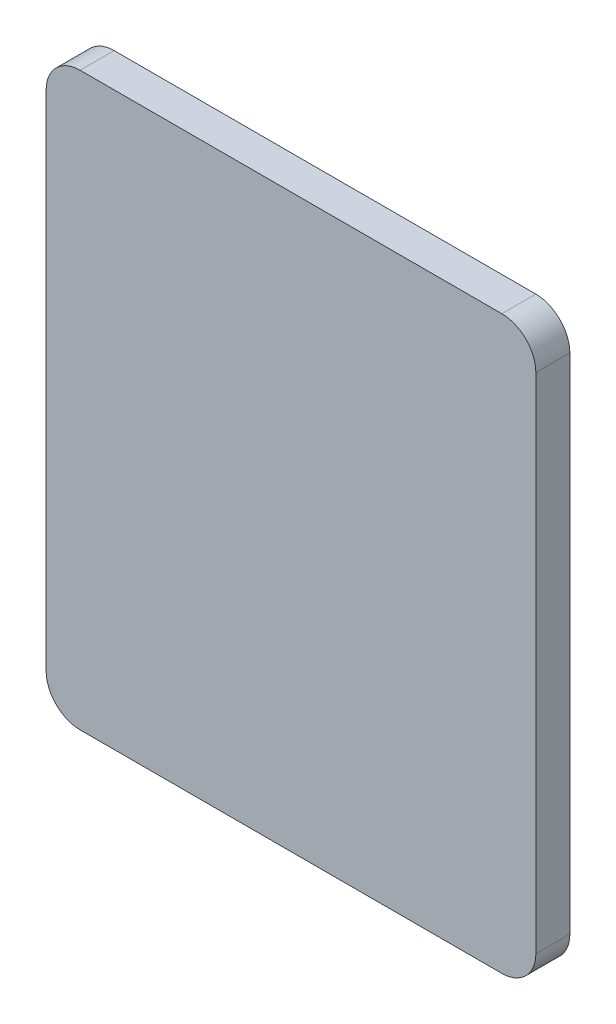
ISO-10303-21;
HEADER;
FILE_DESCRIPTION(('STEP AP214'),'2;1');
FILE_NAME('part.step','',(''),(''),'','','');
FILE_SCHEMA(('AUTOMOTIVE_DESIGN { 1 0 10303 214 1 1 1 1 }'));
ENDSEC;
DATA;
#1=APPLICATION_CONTEXT('core data for automotive mechanical design processes');
#2=APPLICATION_PROTOCOL_DEFINITION('international standard','automotive_design',2000,#1);
#3=PRODUCT_CONTEXT('',#1,'mechanical');
#4=PRODUCT('Part','Part','',(#3));
#5=PRODUCT_RELATED_PRODUCT_CATEGORY('part','',(#4));
#6=PRODUCT_DEFINITION_FORMATION('','',#4);
#7=PRODUCT_DEFINITION_CONTEXT('part definition',#1,'design');
#8=PRODUCT_DEFINITION('design','',#6,#7);
#9=PRODUCT_DEFINITION_SHAPE('','',#8);
#10=(LENGTH_UNIT() NAMED_UNIT(*) SI_UNIT(.MILLI.,.METRE.));
#11=(NAMED_UNIT(*) PLANE_ANGLE_UNIT() SI_UNIT($,.RADIAN.));
#12=(NAMED_UNIT(*) SI_UNIT($,.STERADIAN.) SOLID_ANGLE_UNIT());
#13=UNCERTAINTY_MEASURE_WITH_UNIT(LENGTH_MEASURE(1.E-05),#10,'distance_accuracy_value','');
#14=(GEOMETRIC_REPRESENTATION_CONTEXT(3) GLOBAL_UNCERTAINTY_ASSIGNED_CONTEXT((#13)) GLOBAL_UNIT_ASSIGNED_CONTEXT((#10,
#11,#12)) REPRESENTATION_CONTEXT('',''));
#15=CARTESIAN_POINT('',(0.,0.,0.));
#16=DIRECTION('',(0.,0.,1.));
#17=DIRECTION('',(1.,0.,0.));
#18=AXIS2_PLACEMENT_3D('',#15,#16,#17);
#19=CARTESIAN_POINT('',(6.7,0.500000000000002,-0.05));
#20=DIRECTION('',(0.,0.,1.));
#21=DIRECTION('',(1.,0.,0.));
#22=AXIS2_PLACEMENT_3D('',#19,#20,#21);
#23=CYLINDRICAL_SURFACE('',#22,0.500000000000001);
#24=CARTESIAN_POINT('',(6.7,0.500000000000002,0.5));
#25=DIRECTION('',(0.,0.,1.));
#26=DIRECTION('',(1.,0.,0.));
#27=AXIS2_PLACEMENT_3D('',#24,#25,#26);
#28=CIRCLE('',#27,0.500000000000001);
#29=CARTESIAN_POINT('',(6.7,0.,0.5));
#30=VERTEX_POINT('',#29);
#31=CARTESIAN_POINT('',(7.2,0.500000000000001,0.5));
#32=VERTEX_POINT('',#31);
#33=EDGE_CURVE('E82',#30,#32,#28,.T.);
#34=ORIENTED_EDGE('',*,*,#33,.F.);
#35=CARTESIAN_POINT('',(6.7,0.,0.5));
#36=CARTESIAN_POINT('',(6.7,0.,0.));
#37=B_SPLINE_CURVE_WITH_KNOTS('',1,(#35,#36),.UNSPECIFIED.,.F.,.F.,(2,2),(0.,1.),.UNSPECIFIED.);
#38=CARTESIAN_POINT('',(6.7,0.,0.));
#39=VERTEX_POINT('',#38);
#40=EDGE_CURVE('E80',#39,#30,#37,.F.);
#41=ORIENTED_EDGE('',*,*,#40,.F.);
#42=CARTESIAN_POINT('',(6.7,0.500000000000002,0.));
#43=DIRECTION('',(0.,0.,1.));
#44=DIRECTION('',(1.,0.,0.));
#45=AXIS2_PLACEMENT_3D('',#42,#43,#44);
#46=CIRCLE('',#45,0.500000000000001);
#47=CARTESIAN_POINT('',(7.2,0.500000000000001,0.));
#48=VERTEX_POINT('',#47);
#49=EDGE_CURVE('E21',#48,#39,#46,.F.);
#50=ORIENTED_EDGE('',*,*,#49,.F.);
#51=CARTESIAN_POINT('',(7.2,0.5,0.5));
#52=CARTESIAN_POINT('',(7.2,0.5,0.));
#53=B_SPLINE_CURVE_WITH_KNOTS('',1,(#51,#52),.UNSPECIFIED.,.F.,.F.,(2,2),(0.,1.),.UNSPECIFIED.);
#54=EDGE_CURVE('E137',#32,#48,#53,.T.);
#55=ORIENTED_EDGE('',*,*,#54,.F.);
#56=EDGE_LOOP('',(#34,#41,#50,#55));
#57=FACE_BOUND('',#56,.T.);
#58=ADVANCED_FACE('F17',(#57),#23,.T.);
#59=CARTESIAN_POINT('',(6.7,7.9,-0.05));
#60=DIRECTION('',(0.,0.,1.));
#61=DIRECTION('',(0.,-1.,0.));
#62=AXIS2_PLACEMENT_3D('',#59,#60,#61);
#63=CYLINDRICAL_SURFACE('',#62,0.500000000000001);
#64=CARTESIAN_POINT('',(6.7,7.9,0.5));
#65=DIRECTION('',(0.,0.,1.));
#66=DIRECTION('',(0.,-1.,0.));
#67=AXIS2_PLACEMENT_3D('',#64,#65,#66);
#68=CIRCLE('',#67,0.500000000000001);
#69=CARTESIAN_POINT('',(7.2,7.9,0.5));
#70=VERTEX_POINT('',#69);
#71=CARTESIAN_POINT('',(6.7,8.4,0.5));
#72=VERTEX_POINT('',#71);
#73=EDGE_CURVE('E119',#70,#72,#68,.T.);
#74=ORIENTED_EDGE('',*,*,#73,.F.);
#75=CARTESIAN_POINT('',(7.2,7.9,0.5));
#76=CARTESIAN_POINT('',(7.2,7.9,0.));
#77=B_SPLINE_CURVE_WITH_KNOTS('',1,(#75,#76),.UNSPECIFIED.,.F.,.F.,(2,2),(0.,1.),.UNSPECIFIED.);
#78=CARTESIAN_POINT('',(7.2,7.9,0.));
#79=VERTEX_POINT('',#78);
#80=EDGE_CURVE('E103',#79,#70,#77,.F.);
#81=ORIENTED_EDGE('',*,*,#80,.F.);
#82=CARTESIAN_POINT('',(6.7,7.9,0.));
#83=DIRECTION('',(0.,0.,1.));
#84=DIRECTION('',(0.,-1.,0.));
#85=AXIS2_PLACEMENT_3D('',#82,#83,#84);
#86=CIRCLE('',#85,0.500000000000001);
#87=CARTESIAN_POINT('',(6.7,8.4,0.));
#88=VERTEX_POINT('',#87);
#89=EDGE_CURVE('E98',#88,#79,#86,.F.);
#90=ORIENTED_EDGE('',*,*,#89,.F.);
#91=CARTESIAN_POINT('',(6.7,8.4,0.));
#92=CARTESIAN_POINT('',(6.7,8.4,0.5));
#93=B_SPLINE_CURVE_WITH_KNOTS('',1,(#91,#92),.UNSPECIFIED.,.F.,.F.,(2,2),(0.,1.),.UNSPECIFIED.);
#94=EDGE_CURVE('E170',#72,#88,#93,.F.);
#95=ORIENTED_EDGE('',*,*,#94,.F.);
#96=EDGE_LOOP('',(#74,#81,#90,#95));
#97=FACE_BOUND('',#96,.T.);
#98=ADVANCED_FACE('F217',(#97),#63,.T.);
#99=CARTESIAN_POINT('',(7.2,0.,0.));
#100=DIRECTION('',(0.,0.,-1.));
#101=DIRECTION('',(-1.,0.,0.));
#102=AXIS2_PLACEMENT_3D('',#99,#100,#101);
#103=PLANE('',#102);
#104=CARTESIAN_POINT('',(0.5,8.4,0.));
#105=CARTESIAN_POINT('',(6.7,8.4,0.));
#106=B_SPLINE_CURVE_WITH_KNOTS('',1,(#104,#105),.UNSPECIFIED.,.F.,.F.,(2,2),(0.,1.),.UNSPECIFIED.);
#107=CARTESIAN_POINT('',(0.5,8.4,0.));
#108=VERTEX_POINT('',#107);
#109=EDGE_CURVE('E129',#88,#108,#106,.F.);
#110=ORIENTED_EDGE('',*,*,#109,.F.);
#111=ORIENTED_EDGE('',*,*,#89,.T.);
#112=CARTESIAN_POINT('',(7.2,0.5,0.));
#113=CARTESIAN_POINT('',(7.2,7.9,0.));
#114=B_SPLINE_CURVE_WITH_KNOTS('',1,(#112,#113),.UNSPECIFIED.,.F.,.F.,(2,2),(0.,1.),.UNSPECIFIED.);
#115=EDGE_CURVE('E96',#48,#79,#114,.T.);
#116=ORIENTED_EDGE('',*,*,#115,.F.);
#117=ORIENTED_EDGE('',*,*,#49,.T.);
#118=CARTESIAN_POINT('',(0.5,0.,0.));
#119=CARTESIAN_POINT('',(6.7,0.,0.));
#120=B_SPLINE_CURVE_WITH_KNOTS('',1,(#118,#119),.UNSPECIFIED.,.F.,.F.,(2,2),(0.,1.),.UNSPECIFIED.);
#121=CARTESIAN_POINT('',(0.5,0.,0.));
#122=VERTEX_POINT('',#121);
#123=EDGE_CURVE('E87',#122,#39,#120,.T.);
#124=ORIENTED_EDGE('',*,*,#123,.F.);
#125=CARTESIAN_POINT('',(0.5,0.5,0.));
#126=DIRECTION('',(0.,0.,1.));
#127=DIRECTION('',(0.,-1.,0.));
#128=AXIS2_PLACEMENT_3D('',#125,#126,#127);
#129=CIRCLE('',#128,0.5);
#130=CARTESIAN_POINT('',(0.,0.5,0.));
#131=VERTEX_POINT('',#130);
#132=EDGE_CURVE('E88',#131,#122,#129,.T.);
#133=ORIENTED_EDGE('',*,*,#132,.F.);
#134=CARTESIAN_POINT('',(0.,0.5,0.));
#135=CARTESIAN_POINT('',(0.,7.9,0.));
#136=B_SPLINE_CURVE_WITH_KNOTS('',1,(#134,#135),.UNSPECIFIED.,.F.,.F.,(2,2),(0.,1.),.UNSPECIFIED.);
#137=CARTESIAN_POINT('',(0.,7.9,0.));
#138=VERTEX_POINT('',#137);
#139=EDGE_CURVE('E156',#138,#131,#136,.F.);
#140=ORIENTED_EDGE('',*,*,#139,.F.);
#141=CARTESIAN_POINT('',(0.5,7.9,0.));
#142=DIRECTION('',(0.,0.,1.));
#143=DIRECTION('',(0.,-1.,0.));
#144=AXIS2_PLACEMENT_3D('',#141,#142,#143);
#145=CIRCLE('',#144,0.5);
#146=EDGE_CURVE('E126',#108,#138,#145,.T.);
#147=ORIENTED_EDGE('',*,*,#146,.F.);
#148=EDGE_LOOP('',(#110,#111,#116,#117,#124,#133,#140,#147));
#149=FACE_BOUND('',#148,.T.);
#150=ADVANCED_FACE('F92',(#149),#103,.T.);
#151=CARTESIAN_POINT('',(0.5,7.9,-0.05));
#152=DIRECTION('',(0.,0.,1.));
#153=DIRECTION('',(0.,-1.,0.));
#154=AXIS2_PLACEMENT_3D('',#151,#152,#153);
#155=CYLINDRICAL_SURFACE('',#154,0.5);
#156=CARTESIAN_POINT('',(0.5,7.9,0.5));
#157=DIRECTION('',(0.,0.,1.));
#158=DIRECTION('',(0.,-1.,0.));
#159=AXIS2_PLACEMENT_3D('',#156,#157,#158);
#160=CIRCLE('',#159,0.5);
#161=CARTESIAN_POINT('',(0.5,8.4,0.5));
#162=VERTEX_POINT('',#161);
#163=CARTESIAN_POINT('',(0.,7.9,0.5));
#164=VERTEX_POINT('',#163);
#165=EDGE_CURVE('E115',#162,#164,#160,.T.);
#166=ORIENTED_EDGE('',*,*,#165,.F.);
#167=CARTESIAN_POINT('',(0.5,8.4,0.));
#168=CARTESIAN_POINT('',(0.5,8.4,0.5));
#169=B_SPLINE_CURVE_WITH_KNOTS('',1,(#167,#168),.UNSPECIFIED.,.F.,.F.,(2,2),(0.,1.),.UNSPECIFIED.);
#170=EDGE_CURVE('E164',#108,#162,#169,.T.);
#171=ORIENTED_EDGE('',*,*,#170,.F.);
#172=ORIENTED_EDGE('',*,*,#146,.T.);
#173=CARTESIAN_POINT('',(0.,7.9,0.));
#174=CARTESIAN_POINT('',(0.,7.9,0.5));
#175=B_SPLINE_CURVE_WITH_KNOTS('',1,(#173,#174),.UNSPECIFIED.,.F.,.F.,(2,2),(0.,1.),.UNSPECIFIED.);
#176=EDGE_CURVE('E163',#164,#138,#175,.F.);
#177=ORIENTED_EDGE('',*,*,#176,.F.);
#178=EDGE_LOOP('',(#166,#171,#172,#177));
#179=FACE_BOUND('',#178,.T.);
#180=ADVANCED_FACE('F215',(#179),#155,.T.);
#181=CARTESIAN_POINT('',(0.5,0.5,-0.05));
#182=DIRECTION('',(0.,0.,1.));
#183=DIRECTION('',(0.,-1.,0.));
#184=AXIS2_PLACEMENT_3D('',#181,#182,#183);
#185=CYLINDRICAL_SURFACE('',#184,0.5);
#186=CARTESIAN_POINT('',(0.5,0.5,0.5));
#187=DIRECTION('',(0.,0.,1.));
#188=DIRECTION('',(0.,-1.,0.));
#189=AXIS2_PLACEMENT_3D('',#186,#187,#188);
#190=CIRCLE('',#189,0.5);
#191=CARTESIAN_POINT('',(0.,0.5,0.5));
#192=VERTEX_POINT('',#191);
#193=CARTESIAN_POINT('',(0.5,0.,0.5));
#194=VERTEX_POINT('',#193);
#195=EDGE_CURVE('E11',#192,#194,#190,.T.);
#196=ORIENTED_EDGE('',*,*,#195,.F.);
#197=CARTESIAN_POINT('',(0.,0.5,0.));
#198=CARTESIAN_POINT('',(0.,0.5,0.5));
#199=B_SPLINE_CURVE_WITH_KNOTS('',1,(#197,#198),.UNSPECIFIED.,.F.,.F.,(2,2),(0.,1.),.UNSPECIFIED.);
#200=EDGE_CURVE('E181',#131,#192,#199,.T.);
#201=ORIENTED_EDGE('',*,*,#200,.F.);
#202=ORIENTED_EDGE('',*,*,#132,.T.);
#203=CARTESIAN_POINT('',(0.5,0.,0.5));
#204=CARTESIAN_POINT('',(0.5,0.,0.));
#205=B_SPLINE_CURVE_WITH_KNOTS('',1,(#203,#204),.UNSPECIFIED.,.F.,.F.,(2,2),(0.,1.),.UNSPECIFIED.);
#206=EDGE_CURVE('E101',#194,#122,#205,.T.);
#207=ORIENTED_EDGE('',*,*,#206,.F.);
#208=EDGE_LOOP('',(#196,#201,#202,#207));
#209=FACE_BOUND('',#208,.T.);
#210=ADVANCED_FACE('F212',(#209),#185,.T.);
#211=CARTESIAN_POINT('',(0.5,0.,0.5));
#212=DIRECTION('',(0.,-1.,0.));
#213=DIRECTION('',(0.,0.,-1.));
#214=AXIS2_PLACEMENT_3D('',#211,#212,#213);
#215=PLANE('',#214);
#216=ORIENTED_EDGE('',*,*,#206,.T.);
#217=ORIENTED_EDGE('',*,*,#123,.T.);
#218=ORIENTED_EDGE('',*,*,#40,.T.);
#219=DIRECTION('',(1.,0.,0.));
#220=VECTOR('',#219,1.);
#221=CARTESIAN_POINT('',(3.6,0.,0.5));
#222=LINE('',#221,#220);
#223=EDGE_CURVE('E124',#194,#30,#222,.T.);
#224=ORIENTED_EDGE('',*,*,#223,.F.);
#225=EDGE_LOOP('',(#216,#217,#218,#224));
#226=FACE_BOUND('',#225,.T.);
#227=ADVANCED_FACE('F100',(#226),#215,.T.);
#228=CARTESIAN_POINT('',(7.2,0.5,0.5));
#229=DIRECTION('',(1.,0.,0.));
#230=DIRECTION('',(0.,0.,-1.));
#231=AXIS2_PLACEMENT_3D('',#228,#229,#230);
#232=PLANE('',#231);
#233=ORIENTED_EDGE('',*,*,#54,.T.);
#234=ORIENTED_EDGE('',*,*,#115,.T.);
#235=ORIENTED_EDGE('',*,*,#80,.T.);
#236=DIRECTION('',(0.,1.,0.));
#237=VECTOR('',#236,1.);
#238=CARTESIAN_POINT('',(7.2,4.2,0.5));
#239=LINE('',#238,#237);
#240=EDGE_CURVE('E122',#32,#70,#239,.T.);
#241=ORIENTED_EDGE('',*,*,#240,.F.);
#242=EDGE_LOOP('',(#233,#234,#235,#241));
#243=FACE_BOUND('',#242,.T.);
#244=ADVANCED_FACE('F134',(#243),#232,.T.);
#245=CARTESIAN_POINT('',(0.5,8.4,0.));
#246=DIRECTION('',(0.,1.,0.));
#247=DIRECTION('',(0.,0.,1.));
#248=AXIS2_PLACEMENT_3D('',#245,#246,#247);
#249=PLANE('',#248);
#250=ORIENTED_EDGE('',*,*,#170,.T.);
#251=DIRECTION('',(-1.,0.,0.));
#252=VECTOR('',#251,1.);
#253=CARTESIAN_POINT('',(3.6,8.4,0.5));
#254=LINE('',#253,#252);
#255=EDGE_CURVE('E118',#72,#162,#254,.T.);
#256=ORIENTED_EDGE('',*,*,#255,.F.);
#257=ORIENTED_EDGE('',*,*,#94,.T.);
#258=ORIENTED_EDGE('',*,*,#109,.T.);
#259=EDGE_LOOP('',(#250,#256,#257,#258));
#260=FACE_BOUND('',#259,.T.);
#261=ADVANCED_FACE('F216',(#260),#249,.T.);
#262=CARTESIAN_POINT('',(0.,0.5,0.));
#263=DIRECTION('',(-1.,0.,0.));
#264=DIRECTION('',(0.,0.,1.));
#265=AXIS2_PLACEMENT_3D('',#262,#263,#264);
#266=PLANE('',#265);
#267=ORIENTED_EDGE('',*,*,#200,.T.);
#268=DIRECTION('',(0.,-1.,0.));
#269=VECTOR('',#268,1.);
#270=CARTESIAN_POINT('',(0.,4.2,0.5));
#271=LINE('',#270,#269);
#272=EDGE_CURVE('E27',#164,#192,#271,.T.);
#273=ORIENTED_EDGE('',*,*,#272,.F.);
#274=ORIENTED_EDGE('',*,*,#176,.T.);
#275=ORIENTED_EDGE('',*,*,#139,.T.);
#276=EDGE_LOOP('',(#267,#273,#274,#275));
#277=FACE_BOUND('',#276,.T.);
#278=ADVANCED_FACE('F211',(#277),#266,.T.);
#279=CARTESIAN_POINT('',(0.,0.,0.5));
#280=DIRECTION('',(0.,0.,1.));
#281=DIRECTION('',(1.,0.,0.));
#282=AXIS2_PLACEMENT_3D('',#279,#280,#281);
#283=PLANE('',#282);
#284=ORIENTED_EDGE('',*,*,#272,.T.);
#285=ORIENTED_EDGE('',*,*,#195,.T.);
#286=ORIENTED_EDGE('',*,*,#223,.T.);
#287=ORIENTED_EDGE('',*,*,#33,.T.);
#288=ORIENTED_EDGE('',*,*,#240,.T.);
#289=ORIENTED_EDGE('',*,*,#73,.T.);
#290=ORIENTED_EDGE('',*,*,#255,.T.);
#291=ORIENTED_EDGE('',*,*,#165,.T.);
#292=EDGE_LOOP('',(#284,#285,#286,#287,#288,#289,#290,#291));
#293=FACE_BOUND('',#292,.T.);
#294=ADVANCED_FACE('F19',(#293),#283,.T.);
#295=CLOSED_SHELL('',(#58,#98,#150,#180,#210,#227,#244,#261,#278,#294));
#296=MANIFOLD_SOLID_BREP('B1',#295);
#297=ADVANCED_BREP_SHAPE_REPRESENTATION('',(#18,#296),#14);
#298=SHAPE_DEFINITION_REPRESENTATION(#9,#297);
ENDSEC;
END-ISO-10303-21;
